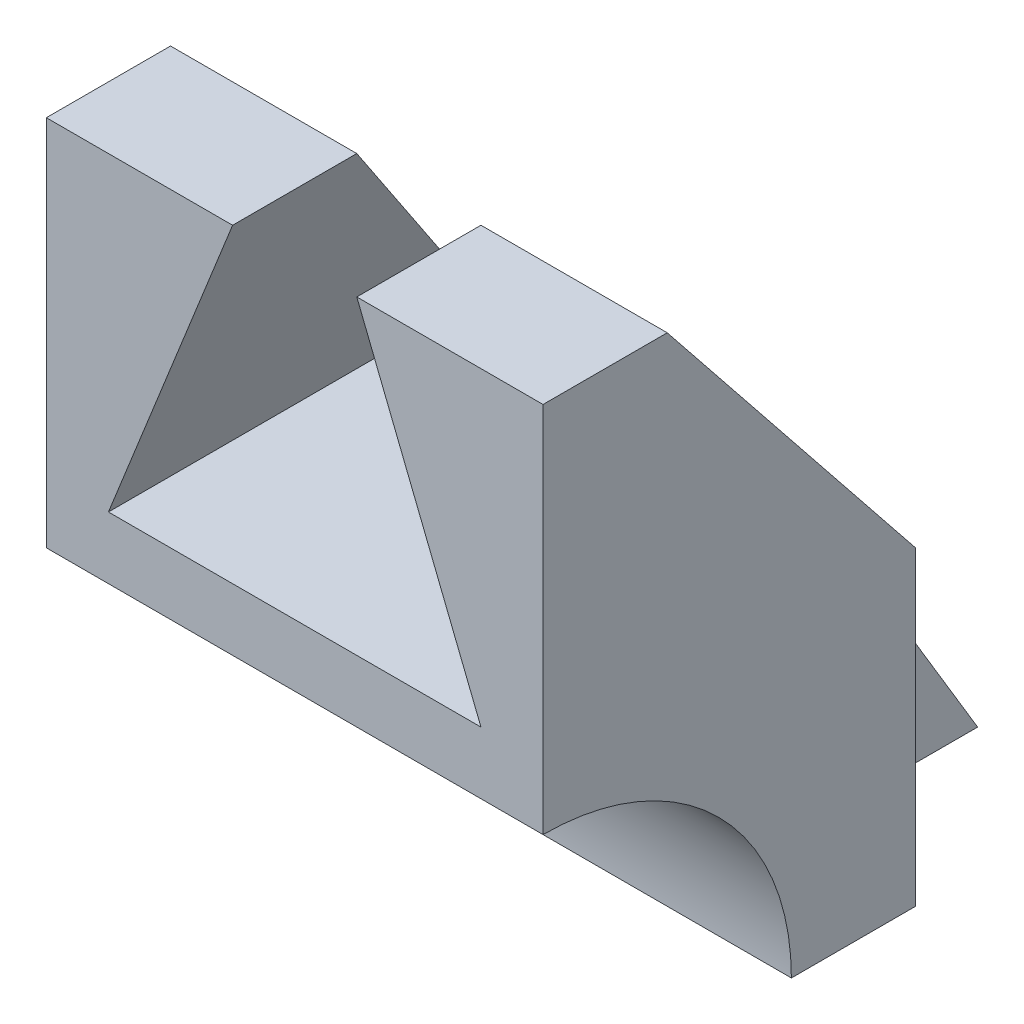
ISO-10303-21;
HEADER;
FILE_DESCRIPTION(('STEP AP214'),'2;1');
FILE_NAME('part.step','',(''),(''),'','','');
FILE_SCHEMA(('AUTOMOTIVE_DESIGN { 1 0 10303 214 1 1 1 1 }'));
ENDSEC;
DATA;
#1=APPLICATION_CONTEXT('core data for automotive mechanical design processes');
#2=APPLICATION_PROTOCOL_DEFINITION('international standard','automotive_design',2000,#1);
#3=PRODUCT_CONTEXT('',#1,'mechanical');
#4=PRODUCT('Part','Part','',(#3));
#5=PRODUCT_RELATED_PRODUCT_CATEGORY('part','',(#4));
#6=PRODUCT_DEFINITION_FORMATION('','',#4);
#7=PRODUCT_DEFINITION_CONTEXT('part definition',#1,'design');
#8=PRODUCT_DEFINITION('design','',#6,#7);
#9=PRODUCT_DEFINITION_SHAPE('','',#8);
#10=(LENGTH_UNIT() NAMED_UNIT(*) SI_UNIT(.MILLI.,.METRE.));
#11=(NAMED_UNIT(*) PLANE_ANGLE_UNIT() SI_UNIT($,.RADIAN.));
#12=(NAMED_UNIT(*) SI_UNIT($,.STERADIAN.) SOLID_ANGLE_UNIT());
#13=UNCERTAINTY_MEASURE_WITH_UNIT(LENGTH_MEASURE(1.E-05),#10,'distance_accuracy_value','');
#14=(GEOMETRIC_REPRESENTATION_CONTEXT(3) GLOBAL_UNCERTAINTY_ASSIGNED_CONTEXT((#13)) GLOBAL_UNIT_ASSIGNED_CONTEXT((#10,
#11,#12)) REPRESENTATION_CONTEXT('',''));
#15=CARTESIAN_POINT('',(0.,0.,0.));
#16=DIRECTION('',(0.,0.,1.));
#17=DIRECTION('',(1.,0.,0.));
#18=AXIS2_PLACEMENT_3D('',#15,#16,#17);
#19=CARTESIAN_POINT('',(20.,24.390243902439,-30.4878048780488));
#20=DIRECTION('',(0.,0.624695047554424,-0.78086880944303));
#21=DIRECTION('',(0.,0.78086880944303,0.624695047554424));
#22=AXIS2_PLACEMENT_3D('',#19,#20,#21);
#23=PLANE('',#22);
#24=DIRECTION('',(0.298142396999972,-0.74535599249993,-0.596284793999944));
#25=VECTOR('',#24,1.);
#26=CARTESIAN_POINT('',(15.6666666666667,23.3333333333333,-31.3333333333333));
#27=LINE('',#26,#25);
#28=CARTESIAN_POINT('',(5.,50.,-10.));
#29=VERTEX_POINT('',#28);
#30=CARTESIAN_POINT('',(15.,25.,-30.));
#31=VERTEX_POINT('',#30);
#32=EDGE_CURVE('E108',#29,#31,#27,.T.);
#33=ORIENTED_EDGE('',*,*,#32,.F.);
#34=DIRECTION('',(-1.,0.,0.));
#35=VECTOR('',#34,1.);
#36=CARTESIAN_POINT('',(20.,50.,-10.));
#37=LINE('',#36,#35);
#38=CARTESIAN_POINT('',(20.,50.,-10.));
#39=VERTEX_POINT('',#38);
#40=EDGE_CURVE('E102',#39,#29,#37,.T.);
#41=ORIENTED_EDGE('',*,*,#40,.F.);
#42=DIRECTION('',(0.,-0.78086880944303,-0.624695047554424));
#43=VECTOR('',#42,1.);
#44=CARTESIAN_POINT('',(20.,24.390243902439,-30.4878048780488));
#45=LINE('',#44,#43);
#46=CARTESIAN_POINT('',(20.,25.,-30.));
#47=VERTEX_POINT('',#46);
#48=EDGE_CURVE('E105',#39,#47,#45,.T.);
#49=ORIENTED_EDGE('',*,*,#48,.T.);
#50=DIRECTION('',(-1.,0.,0.));
#51=VECTOR('',#50,1.);
#52=CARTESIAN_POINT('',(20.,25.,-30.));
#53=LINE('',#52,#51);
#54=EDGE_CURVE('E155',#47,#31,#53,.T.);
#55=ORIENTED_EDGE('',*,*,#54,.T.);
#56=EDGE_LOOP('',(#33,#41,#49,#55));
#57=FACE_BOUND('',#56,.T.);
#58=ADVANCED_FACE('F35',(#57),#23,.T.);
#59=CARTESIAN_POINT('',(20.,50.,0.));
#60=DIRECTION('',(0.,1.,0.));
#61=DIRECTION('',(0.,0.,1.));
#62=AXIS2_PLACEMENT_3D('',#59,#60,#61);
#63=PLANE('',#62);
#64=DIRECTION('',(0.,0.,1.));
#65=VECTOR('',#64,1.);
#66=CARTESIAN_POINT('',(5.,50.,-45.));
#67=LINE('',#66,#65);
#68=CARTESIAN_POINT('',(5.,50.,0.));
#69=VERTEX_POINT('',#68);
#70=EDGE_CURVE('E212',#29,#69,#67,.T.);
#71=ORIENTED_EDGE('',*,*,#70,.T.);
#72=DIRECTION('',(-1.,0.,0.));
#73=VECTOR('',#72,1.);
#74=CARTESIAN_POINT('',(20.,50.,0.));
#75=LINE('',#74,#73);
#76=CARTESIAN_POINT('',(20.,50.,0.));
#77=VERTEX_POINT('',#76);
#78=EDGE_CURVE('E127',#77,#69,#75,.T.);
#79=ORIENTED_EDGE('',*,*,#78,.F.);
#80=DIRECTION('',(0.,0.,-1.));
#81=VECTOR('',#80,1.);
#82=CARTESIAN_POINT('',(20.,50.,0.));
#83=LINE('',#82,#81);
#84=EDGE_CURVE('E120',#77,#39,#83,.T.);
#85=ORIENTED_EDGE('',*,*,#84,.T.);
#86=ORIENTED_EDGE('',*,*,#40,.T.);
#87=EDGE_LOOP('',(#71,#79,#85,#86));
#88=FACE_BOUND('',#87,.T.);
#89=ADVANCED_FACE('F125',(#88),#63,.T.);
#90=CARTESIAN_POINT('',(20.,0.,-30.));
#91=DIRECTION('',(0.,0.,1.));
#92=DIRECTION('',(1.,0.,0.));
#93=AXIS2_PLACEMENT_3D('',#90,#91,#92);
#94=PLANE('',#93);
#95=DIRECTION('',(0.,1.,0.));
#96=VECTOR('',#95,1.);
#97=CARTESIAN_POINT('',(-10.,0.,-30.));
#98=LINE('',#97,#96);
#99=CARTESIAN_POINT('',(-10.,0.,-30.));
#100=VERTEX_POINT('',#99);
#101=CARTESIAN_POINT('',(-10.,25.,-30.));
#102=VERTEX_POINT('',#101);
#103=EDGE_CURVE('E170',#100,#102,#98,.T.);
#104=ORIENTED_EDGE('',*,*,#103,.F.);
#105=DIRECTION('',(-1.,0.,0.));
#106=VECTOR('',#105,1.);
#107=CARTESIAN_POINT('',(20.,0.,-30.));
#108=LINE('',#107,#106);
#109=CARTESIAN_POINT('',(-20.,0.,-30.));
#110=VERTEX_POINT('',#109);
#111=EDGE_CURVE('E156',#100,#110,#108,.T.);
#112=ORIENTED_EDGE('',*,*,#111,.T.);
#113=DIRECTION('',(0.,1.,0.));
#114=VECTOR('',#113,1.);
#115=CARTESIAN_POINT('',(-20.,0.,-30.));
#116=LINE('',#115,#114);
#117=CARTESIAN_POINT('',(-20.,25.,-30.));
#118=VERTEX_POINT('',#117);
#119=EDGE_CURVE('E139',#110,#118,#116,.T.);
#120=ORIENTED_EDGE('',*,*,#119,.T.);
#121=CARTESIAN_POINT('',(-15.,25.,-30.));
#122=VERTEX_POINT('',#121);
#123=EDGE_CURVE('E112',#122,#118,#53,.T.);
#124=ORIENTED_EDGE('',*,*,#123,.F.);
#125=EDGE_CURVE('E157',#102,#122,#53,.T.);
#126=ORIENTED_EDGE('',*,*,#125,.F.);
#127=EDGE_LOOP('',(#104,#112,#120,#124,#126));
#128=FACE_BOUND('',#127,.T.);
#129=ADVANCED_FACE('F165',(#128),#94,.F.);
#130=CARTESIAN_POINT('',(20.,0.,0.));
#131=DIRECTION('',(-1.,0.,0.));
#132=DIRECTION('',(0.,0.,1.));
#133=AXIS2_PLACEMENT_3D('',#130,#131,#132);
#134=CYLINDRICAL_SURFACE('',#133,20.);
#135=CARTESIAN_POINT('',(-20.,0.,0.));
#136=DIRECTION('',(1.,0.,0.));
#137=DIRECTION('',(0.,0.,-1.));
#138=AXIS2_PLACEMENT_3D('',#135,#136,#137);
#139=CIRCLE('',#138,20.);
#140=CARTESIAN_POINT('',(-20.,0.,-20.));
#141=VERTEX_POINT('',#140);
#142=CARTESIAN_POINT('',(-20.,20.,0.));
#143=VERTEX_POINT('',#142);
#144=EDGE_CURVE('E133',#141,#143,#139,.T.);
#145=ORIENTED_EDGE('',*,*,#144,.F.);
#146=DIRECTION('',(-1.,0.,0.));
#147=VECTOR('',#146,1.);
#148=CARTESIAN_POINT('',(20.,0.,-20.));
#149=LINE('',#148,#147);
#150=CARTESIAN_POINT('',(20.,0.,-20.));
#151=VERTEX_POINT('',#150);
#152=EDGE_CURVE('E11',#151,#141,#149,.T.);
#153=ORIENTED_EDGE('',*,*,#152,.F.);
#154=CARTESIAN_POINT('',(20.,0.,0.));
#155=DIRECTION('',(1.,0.,0.));
#156=DIRECTION('',(0.,0.,-1.));
#157=AXIS2_PLACEMENT_3D('',#154,#155,#156);
#158=CIRCLE('',#157,20.);
#159=CARTESIAN_POINT('',(20.,20.,0.));
#160=VERTEX_POINT('',#159);
#161=EDGE_CURVE('E151',#151,#160,#158,.T.);
#162=ORIENTED_EDGE('',*,*,#161,.T.);
#163=DIRECTION('',(-1.,0.,0.));
#164=VECTOR('',#163,1.);
#165=CARTESIAN_POINT('',(20.,20.,0.));
#166=LINE('',#165,#164);
#167=EDGE_CURVE('E59',#160,#143,#166,.T.);
#168=ORIENTED_EDGE('',*,*,#167,.T.);
#169=EDGE_LOOP('',(#145,#153,#162,#168));
#170=FACE_BOUND('',#169,.T.);
#171=ADVANCED_FACE('F37',(#170),#134,.F.);
#172=CARTESIAN_POINT('',(20.,0.,0.));
#173=DIRECTION('',(0.,1.,0.));
#174=DIRECTION('',(0.,0.,1.));
#175=AXIS2_PLACEMENT_3D('',#172,#173,#174);
#176=PLANE('',#175);
#177=DIRECTION('',(0.,0.,-1.));
#178=VECTOR('',#177,1.);
#179=CARTESIAN_POINT('',(-20.,0.,0.));
#180=LINE('',#179,#178);
#181=EDGE_CURVE('E135',#141,#110,#180,.T.);
#182=ORIENTED_EDGE('',*,*,#181,.T.);
#183=ORIENTED_EDGE('',*,*,#111,.F.);
#184=DIRECTION('',(0.,0.,-1.));
#185=VECTOR('',#184,1.);
#186=CARTESIAN_POINT('',(-10.,0.,0.));
#187=LINE('',#186,#185);
#188=CARTESIAN_POINT('',(-10.,0.,-45.));
#189=VERTEX_POINT('',#188);
#190=EDGE_CURVE('E221',#100,#189,#187,.T.);
#191=ORIENTED_EDGE('',*,*,#190,.T.);
#192=DIRECTION('',(-1.,0.,0.));
#193=VECTOR('',#192,1.);
#194=CARTESIAN_POINT('',(10.,0.,-45.));
#195=LINE('',#194,#193);
#196=CARTESIAN_POINT('',(10.,0.,-45.));
#197=VERTEX_POINT('',#196);
#198=EDGE_CURVE('E136',#197,#189,#195,.T.);
#199=ORIENTED_EDGE('',*,*,#198,.F.);
#200=DIRECTION('',(0.,0.,-1.));
#201=VECTOR('',#200,1.);
#202=CARTESIAN_POINT('',(10.,0.,0.));
#203=LINE('',#202,#201);
#204=CARTESIAN_POINT('',(10.,0.,-30.));
#205=VERTEX_POINT('',#204);
#206=EDGE_CURVE('E222',#205,#197,#203,.T.);
#207=ORIENTED_EDGE('',*,*,#206,.F.);
#208=CARTESIAN_POINT('',(20.,0.,-30.));
#209=VERTEX_POINT('',#208);
#210=EDGE_CURVE('E43',#209,#205,#108,.T.);
#211=ORIENTED_EDGE('',*,*,#210,.F.);
#212=DIRECTION('',(0.,0.,-1.));
#213=VECTOR('',#212,1.);
#214=CARTESIAN_POINT('',(20.,0.,0.));
#215=LINE('',#214,#213);
#216=EDGE_CURVE('E238',#151,#209,#215,.T.);
#217=ORIENTED_EDGE('',*,*,#216,.F.);
#218=ORIENTED_EDGE('',*,*,#152,.T.);
#219=EDGE_LOOP('',(#182,#183,#191,#199,#207,#211,#217,#218));
#220=FACE_BOUND('',#219,.T.);
#221=ADVANCED_FACE('F174',(#220),#176,.F.);
#222=ORIENTED_EDGE('',*,*,#210,.T.);
#223=DIRECTION('',(0.,1.,0.));
#224=VECTOR('',#223,1.);
#225=CARTESIAN_POINT('',(10.,0.,-30.));
#226=LINE('',#225,#224);
#227=CARTESIAN_POINT('',(10.,25.,-30.));
#228=VERTEX_POINT('',#227);
#229=EDGE_CURVE('E228',#205,#228,#226,.T.);
#230=ORIENTED_EDGE('',*,*,#229,.T.);
#231=DIRECTION('',(-1.,0.,0.));
#232=VECTOR('',#231,1.);
#233=CARTESIAN_POINT('',(20.,25.,-30.));
#234=LINE('',#233,#232);
#235=EDGE_CURVE('E50',#31,#228,#234,.T.);
#236=ORIENTED_EDGE('',*,*,#235,.F.);
#237=ORIENTED_EDGE('',*,*,#54,.F.);
#238=DIRECTION('',(0.,1.,0.));
#239=VECTOR('',#238,1.);
#240=CARTESIAN_POINT('',(20.,0.,-30.));
#241=LINE('',#240,#239);
#242=EDGE_CURVE('E122',#209,#47,#241,.T.);
#243=ORIENTED_EDGE('',*,*,#242,.F.);
#244=EDGE_LOOP('',(#222,#230,#236,#237,#243));
#245=FACE_BOUND('',#244,.T.);
#246=ADVANCED_FACE('F242',(#245),#94,.F.);
#247=DIRECTION('',(0.298142396999972,0.74535599249993,0.596284793999944));
#248=VECTOR('',#247,1.);
#249=CARTESIAN_POINT('',(-12.1111111111111,32.2222222222222,-24.2222222222222));
#250=LINE('',#249,#248);
#251=CARTESIAN_POINT('',(-5.,50.,-10.));
#252=VERTEX_POINT('',#251);
#253=EDGE_CURVE('E186',#122,#252,#250,.T.);
#254=ORIENTED_EDGE('',*,*,#253,.F.);
#255=ORIENTED_EDGE('',*,*,#123,.T.);
#256=DIRECTION('',(0.,-0.78086880944303,-0.624695047554424));
#257=VECTOR('',#256,1.);
#258=CARTESIAN_POINT('',(-20.,24.390243902439,-30.4878048780488));
#259=LINE('',#258,#257);
#260=CARTESIAN_POINT('',(-20.,50.,-10.));
#261=VERTEX_POINT('',#260);
#262=EDGE_CURVE('E142',#261,#118,#259,.T.);
#263=ORIENTED_EDGE('',*,*,#262,.F.);
#264=EDGE_CURVE('E113',#252,#261,#37,.T.);
#265=ORIENTED_EDGE('',*,*,#264,.F.);
#266=EDGE_LOOP('',(#254,#255,#263,#265));
#267=FACE_BOUND('',#266,.T.);
#268=ADVANCED_FACE('F182',(#267),#23,.T.);
#269=DIRECTION('',(0.,0.,1.));
#270=VECTOR('',#269,1.);
#271=CARTESIAN_POINT('',(-5.,50.,-45.));
#272=LINE('',#271,#270);
#273=CARTESIAN_POINT('',(-5.,50.,0.));
#274=VERTEX_POINT('',#273);
#275=EDGE_CURVE('E209',#252,#274,#272,.T.);
#276=ORIENTED_EDGE('',*,*,#275,.F.);
#277=ORIENTED_EDGE('',*,*,#264,.T.);
#278=DIRECTION('',(0.,0.,-1.));
#279=VECTOR('',#278,1.);
#280=CARTESIAN_POINT('',(-20.,50.,0.));
#281=LINE('',#280,#279);
#282=CARTESIAN_POINT('',(-20.,50.,0.));
#283=VERTEX_POINT('',#282);
#284=EDGE_CURVE('E145',#283,#261,#281,.T.);
#285=ORIENTED_EDGE('',*,*,#284,.F.);
#286=EDGE_CURVE('E153',#274,#283,#75,.T.);
#287=ORIENTED_EDGE('',*,*,#286,.F.);
#288=EDGE_LOOP('',(#276,#277,#285,#287));
#289=FACE_BOUND('',#288,.T.);
#290=ADVANCED_FACE('F279',(#289),#63,.T.);
#291=CARTESIAN_POINT('',(20.,0.,0.));
#292=DIRECTION('',(0.,0.,1.));
#293=DIRECTION('',(1.,0.,0.));
#294=AXIS2_PLACEMENT_3D('',#291,#292,#293);
#295=PLANE('',#294);
#296=DIRECTION('',(-0.371390676354104,0.928476690885259,0.));
#297=VECTOR('',#296,1.);
#298=CARTESIAN_POINT('',(15.,25.,0.));
#299=LINE('',#298,#297);
#300=CARTESIAN_POINT('',(15.,25.,0.));
#301=VERTEX_POINT('',#300);
#302=EDGE_CURVE('E214',#301,#69,#299,.T.);
#303=ORIENTED_EDGE('',*,*,#302,.F.);
#304=DIRECTION('',(1.,0.,0.));
#305=VECTOR('',#304,1.);
#306=CARTESIAN_POINT('',(-15.,25.,0.));
#307=LINE('',#306,#305);
#308=CARTESIAN_POINT('',(-15.,25.,0.));
#309=VERTEX_POINT('',#308);
#310=EDGE_CURVE('E305',#309,#301,#307,.T.);
#311=ORIENTED_EDGE('',*,*,#310,.F.);
#312=DIRECTION('',(-0.371390676354104,-0.928476690885259,0.));
#313=VECTOR('',#312,1.);
#314=CARTESIAN_POINT('',(-5.,50.,0.));
#315=LINE('',#314,#313);
#316=EDGE_CURVE('E206',#274,#309,#315,.T.);
#317=ORIENTED_EDGE('',*,*,#316,.F.);
#318=ORIENTED_EDGE('',*,*,#286,.T.);
#319=DIRECTION('',(0.,1.,0.));
#320=VECTOR('',#319,1.);
#321=CARTESIAN_POINT('',(-20.,0.,0.));
#322=LINE('',#321,#320);
#323=EDGE_CURVE('E148',#143,#283,#322,.T.);
#324=ORIENTED_EDGE('',*,*,#323,.F.);
#325=ORIENTED_EDGE('',*,*,#167,.F.);
#326=DIRECTION('',(0.,1.,0.));
#327=VECTOR('',#326,1.);
#328=CARTESIAN_POINT('',(20.,0.,0.));
#329=LINE('',#328,#327);
#330=EDGE_CURVE('E128',#160,#77,#329,.T.);
#331=ORIENTED_EDGE('',*,*,#330,.T.);
#332=ORIENTED_EDGE('',*,*,#78,.T.);
#333=EDGE_LOOP('',(#303,#311,#317,#318,#324,#325,#331,#332));
#334=FACE_BOUND('',#333,.T.);
#335=ADVANCED_FACE('F286',(#334),#295,.T.);
#336=CARTESIAN_POINT('',(20.,0.,0.));
#337=DIRECTION('',(1.,0.,0.));
#338=DIRECTION('',(0.,0.,-1.));
#339=AXIS2_PLACEMENT_3D('',#336,#337,#338);
#340=PLANE('',#339);
#341=ORIENTED_EDGE('',*,*,#161,.F.);
#342=ORIENTED_EDGE('',*,*,#216,.T.);
#343=ORIENTED_EDGE('',*,*,#242,.T.);
#344=ORIENTED_EDGE('',*,*,#48,.F.);
#345=ORIENTED_EDGE('',*,*,#84,.F.);
#346=ORIENTED_EDGE('',*,*,#330,.F.);
#347=EDGE_LOOP('',(#341,#342,#343,#344,#345,#346));
#348=FACE_BOUND('',#347,.T.);
#349=ADVANCED_FACE('F118',(#348),#340,.T.);
#350=CARTESIAN_POINT('',(-20.,0.,0.));
#351=DIRECTION('',(1.,0.,0.));
#352=DIRECTION('',(0.,0.,-1.));
#353=AXIS2_PLACEMENT_3D('',#350,#351,#352);
#354=PLANE('',#353);
#355=ORIENTED_EDGE('',*,*,#144,.T.);
#356=ORIENTED_EDGE('',*,*,#323,.T.);
#357=ORIENTED_EDGE('',*,*,#284,.T.);
#358=ORIENTED_EDGE('',*,*,#262,.T.);
#359=ORIENTED_EDGE('',*,*,#119,.F.);
#360=ORIENTED_EDGE('',*,*,#181,.F.);
#361=EDGE_LOOP('',(#355,#356,#357,#358,#359,#360));
#362=FACE_BOUND('',#361,.T.);
#363=ADVANCED_FACE('F176',(#362),#354,.F.);
#364=CARTESIAN_POINT('',(10.,19.8529411764706,-33.0882352941176));
#365=DIRECTION('',(0.,-0.514495755427526,0.857492925712544));
#366=DIRECTION('',(0.,-0.857492925712544,-0.514495755427526));
#367=AXIS2_PLACEMENT_3D('',#364,#365,#366);
#368=PLANE('',#367);
#369=DIRECTION('',(0.,0.857492925712544,0.514495755427526));
#370=VECTOR('',#369,1.);
#371=CARTESIAN_POINT('',(-10.,19.8529411764706,-33.0882352941176));
#372=LINE('',#371,#370);
#373=EDGE_CURVE('E231',#189,#102,#372,.T.);
#374=ORIENTED_EDGE('',*,*,#373,.T.);
#375=DIRECTION('',(-1.,0.,0.));
#376=VECTOR('',#375,1.);
#377=CARTESIAN_POINT('',(10.,25.,-30.));
#378=LINE('',#377,#376);
#379=EDGE_CURVE('E196',#228,#102,#378,.T.);
#380=ORIENTED_EDGE('',*,*,#379,.F.);
#381=DIRECTION('',(0.,0.857492925712544,0.514495755427526));
#382=VECTOR('',#381,1.);
#383=CARTESIAN_POINT('',(10.,19.8529411764706,-33.0882352941176));
#384=LINE('',#383,#382);
#385=EDGE_CURVE('E225',#197,#228,#384,.T.);
#386=ORIENTED_EDGE('',*,*,#385,.F.);
#387=ORIENTED_EDGE('',*,*,#198,.T.);
#388=EDGE_LOOP('',(#374,#380,#386,#387));
#389=FACE_BOUND('',#388,.T.);
#390=ADVANCED_FACE('F260',(#389),#368,.F.);
#391=CARTESIAN_POINT('',(10.,0.,0.));
#392=DIRECTION('',(1.,0.,0.));
#393=DIRECTION('',(0.,0.,-1.));
#394=AXIS2_PLACEMENT_3D('',#391,#392,#393);
#395=PLANE('',#394);
#396=ORIENTED_EDGE('',*,*,#206,.T.);
#397=ORIENTED_EDGE('',*,*,#385,.T.);
#398=ORIENTED_EDGE('',*,*,#229,.F.);
#399=EDGE_LOOP('',(#396,#397,#398));
#400=FACE_BOUND('',#399,.T.);
#401=ADVANCED_FACE('F262',(#400),#395,.T.);
#402=CARTESIAN_POINT('',(-10.,0.,0.));
#403=DIRECTION('',(1.,0.,0.));
#404=DIRECTION('',(0.,0.,-1.));
#405=AXIS2_PLACEMENT_3D('',#402,#403,#404);
#406=PLANE('',#405);
#407=ORIENTED_EDGE('',*,*,#190,.F.);
#408=ORIENTED_EDGE('',*,*,#103,.T.);
#409=ORIENTED_EDGE('',*,*,#373,.F.);
#410=EDGE_LOOP('',(#407,#408,#409));
#411=FACE_BOUND('',#410,.T.);
#412=ADVANCED_FACE('F258',(#411),#406,.F.);
#413=CARTESIAN_POINT('',(15.,25.,-45.));
#414=DIRECTION('',(0.928476690885259,0.371390676354104,0.));
#415=DIRECTION('',(-0.371390676354104,0.92847669088526,0.));
#416=AXIS2_PLACEMENT_3D('',#413,#414,#415);
#417=PLANE('',#416);
#418=ORIENTED_EDGE('',*,*,#32,.T.);
#419=DIRECTION('',(0.,0.,1.));
#420=VECTOR('',#419,1.);
#421=CARTESIAN_POINT('',(15.,25.,-45.));
#422=LINE('',#421,#420);
#423=EDGE_CURVE('E208',#31,#301,#422,.T.);
#424=ORIENTED_EDGE('',*,*,#423,.T.);
#425=ORIENTED_EDGE('',*,*,#302,.T.);
#426=ORIENTED_EDGE('',*,*,#70,.F.);
#427=EDGE_LOOP('',(#418,#424,#425,#426));
#428=FACE_BOUND('',#427,.T.);
#429=ADVANCED_FACE('F269',(#428),#417,.F.);
#430=CARTESIAN_POINT('',(-15.,25.,-45.));
#431=DIRECTION('',(0.,-1.,0.));
#432=DIRECTION('',(0.,0.,-1.));
#433=AXIS2_PLACEMENT_3D('',#430,#431,#432);
#434=PLANE('',#433);
#435=ORIENTED_EDGE('',*,*,#235,.T.);
#436=ORIENTED_EDGE('',*,*,#379,.T.);
#437=ORIENTED_EDGE('',*,*,#125,.T.);
#438=DIRECTION('',(0.,0.,1.));
#439=VECTOR('',#438,1.);
#440=CARTESIAN_POINT('',(-15.,25.,-45.));
#441=LINE('',#440,#439);
#442=EDGE_CURVE('E193',#122,#309,#441,.T.);
#443=ORIENTED_EDGE('',*,*,#442,.T.);
#444=ORIENTED_EDGE('',*,*,#310,.T.);
#445=ORIENTED_EDGE('',*,*,#423,.F.);
#446=EDGE_LOOP('',(#435,#436,#437,#443,#444,#445));
#447=FACE_BOUND('',#446,.T.);
#448=ADVANCED_FACE('F190',(#447),#434,.F.);
#449=CARTESIAN_POINT('',(-5.,50.,-45.));
#450=DIRECTION('',(-0.928476690885259,0.371390676354104,0.));
#451=DIRECTION('',(-0.371390676354104,-0.92847669088526,0.));
#452=AXIS2_PLACEMENT_3D('',#449,#450,#451);
#453=PLANE('',#452);
#454=ORIENTED_EDGE('',*,*,#253,.T.);
#455=ORIENTED_EDGE('',*,*,#275,.T.);
#456=ORIENTED_EDGE('',*,*,#316,.T.);
#457=ORIENTED_EDGE('',*,*,#442,.F.);
#458=EDGE_LOOP('',(#454,#455,#456,#457));
#459=FACE_BOUND('',#458,.T.);
#460=ADVANCED_FACE('F202',(#459),#453,.F.);
#461=CLOSED_SHELL('',(#58,#89,#129,#171,#221,#246,#268,#290,#335,#349,#363,#390,#401,#412,#429,
#448,#460));
#462=MANIFOLD_SOLID_BREP('B2',#461);
#463=ADVANCED_BREP_SHAPE_REPRESENTATION('',(#18,#462),#14);
#464=SHAPE_DEFINITION_REPRESENTATION(#9,#463);
ENDSEC;
END-ISO-10303-21;
